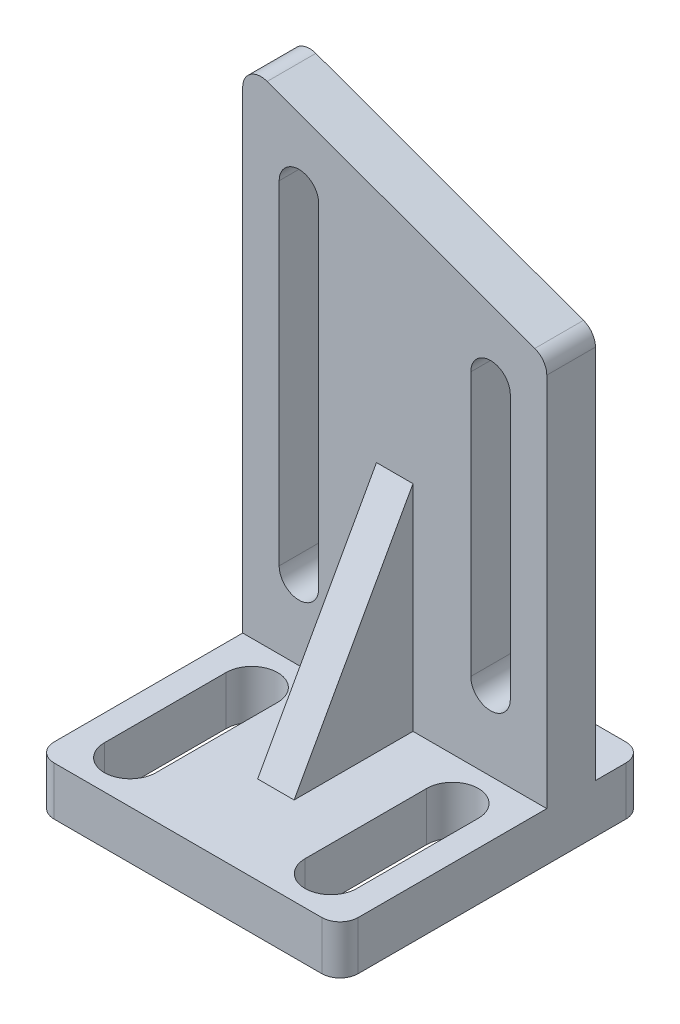
ISO-10303-21;
HEADER;
FILE_DESCRIPTION(('STEP AP214'),'2;1');
FILE_NAME('part.step','',(''),(''),'','','');
FILE_SCHEMA(('AUTOMOTIVE_DESIGN { 1 0 10303 214 1 1 1 1 }'));
ENDSEC;
DATA;
#1=APPLICATION_CONTEXT('core data for automotive mechanical design processes');
#2=APPLICATION_PROTOCOL_DEFINITION('international standard','automotive_design',2000,#1);
#3=PRODUCT_CONTEXT('',#1,'mechanical');
#4=PRODUCT('Part','Part','',(#3));
#5=PRODUCT_RELATED_PRODUCT_CATEGORY('part','',(#4));
#6=PRODUCT_DEFINITION_FORMATION('','',#4);
#7=PRODUCT_DEFINITION_CONTEXT('part definition',#1,'design');
#8=PRODUCT_DEFINITION('design','',#6,#7);
#9=PRODUCT_DEFINITION_SHAPE('','',#8);
#10=(LENGTH_UNIT() NAMED_UNIT(*) SI_UNIT(.MILLI.,.METRE.));
#11=(NAMED_UNIT(*) PLANE_ANGLE_UNIT() SI_UNIT($,.RADIAN.));
#12=(NAMED_UNIT(*) SI_UNIT($,.STERADIAN.) SOLID_ANGLE_UNIT());
#13=UNCERTAINTY_MEASURE_WITH_UNIT(LENGTH_MEASURE(1.E-05),#10,'distance_accuracy_value','');
#14=(GEOMETRIC_REPRESENTATION_CONTEXT(3) GLOBAL_UNCERTAINTY_ASSIGNED_CONTEXT((#13)) GLOBAL_UNIT_ASSIGNED_CONTEXT((#10,
#11,#12)) REPRESENTATION_CONTEXT('',''));
#15=CARTESIAN_POINT('',(0.,0.,0.));
#16=DIRECTION('',(0.,0.,1.));
#17=DIRECTION('',(1.,0.,0.));
#18=AXIS2_PLACEMENT_3D('',#15,#16,#17);
#19=CARTESIAN_POINT('',(0.,8.,0.));
#20=DIRECTION('',(0.,-1.,0.));
#21=DIRECTION('',(0.,0.,-1.));
#22=AXIS2_PLACEMENT_3D('',#19,#20,#21);
#23=PLANE('',#22);
#24=DIRECTION('',(0.,0.,1.));
#25=VECTOR('',#24,1.);
#26=CARTESIAN_POINT('',(12.25,8.,-2.));
#27=LINE('',#26,#25);
#28=CARTESIAN_POINT('',(12.25,8.,-2.));
#29=VERTEX_POINT('',#28);
#30=CARTESIAN_POINT('',(12.25,8.,18.));
#31=VERTEX_POINT('',#30);
#32=EDGE_CURVE('E375',#29,#31,#27,.T.);
#33=ORIENTED_EDGE('',*,*,#32,.F.);
#34=CARTESIAN_POINT('',(16.5,8.,-2.));
#35=DIRECTION('',(0.,1.,0.));
#36=DIRECTION('',(0.,0.,-1.));
#37=AXIS2_PLACEMENT_3D('',#34,#35,#36);
#38=CIRCLE('',#37,4.25);
#39=CARTESIAN_POINT('',(20.75,8.,-2.));
#40=VERTEX_POINT('',#39);
#41=EDGE_CURVE('E325',#40,#29,#38,.T.);
#42=ORIENTED_EDGE('',*,*,#41,.F.);
#43=DIRECTION('',(0.,0.,-1.));
#44=VECTOR('',#43,1.);
#45=CARTESIAN_POINT('',(20.75,8.,-2.));
#46=LINE('',#45,#44);
#47=CARTESIAN_POINT('',(20.75,8.,18.));
#48=VERTEX_POINT('',#47);
#49=EDGE_CURVE('E364',#48,#40,#46,.T.);
#50=ORIENTED_EDGE('',*,*,#49,.F.);
#51=CARTESIAN_POINT('',(16.5,8.,18.));
#52=DIRECTION('',(0.,1.,0.));
#53=DIRECTION('',(0.,0.,-1.));
#54=AXIS2_PLACEMENT_3D('',#51,#52,#53);
#55=CIRCLE('',#54,4.25);
#56=EDGE_CURVE('E378',#31,#48,#55,.T.);
#57=ORIENTED_EDGE('',*,*,#56,.F.);
#58=EDGE_LOOP('',(#33,#42,#50,#57));
#59=FACE_BOUND('',#58,.T.);
#60=DIRECTION('',(0.,0.,1.));
#61=VECTOR('',#60,1.);
#62=CARTESIAN_POINT('',(-20.75,8.,-2.));
#63=LINE('',#62,#61);
#64=CARTESIAN_POINT('',(-20.75,8.,-2.));
#65=VERTEX_POINT('',#64);
#66=CARTESIAN_POINT('',(-20.75,8.,18.));
#67=VERTEX_POINT('',#66);
#68=EDGE_CURVE('E342',#65,#67,#63,.T.);
#69=ORIENTED_EDGE('',*,*,#68,.F.);
#70=CARTESIAN_POINT('',(-16.5,8.,-2.));
#71=DIRECTION('',(0.,1.,0.));
#72=DIRECTION('',(0.,0.,1.));
#73=AXIS2_PLACEMENT_3D('',#70,#71,#72);
#74=CIRCLE('',#73,4.25);
#75=CARTESIAN_POINT('',(-12.25,8.,-2.));
#76=VERTEX_POINT('',#75);
#77=EDGE_CURVE('E340',#76,#65,#74,.T.);
#78=ORIENTED_EDGE('',*,*,#77,.F.);
#79=DIRECTION('',(0.,0.,-1.));
#80=VECTOR('',#79,1.);
#81=CARTESIAN_POINT('',(-12.25,8.,-2.));
#82=LINE('',#81,#80);
#83=CARTESIAN_POINT('',(-12.25,8.,18.));
#84=VERTEX_POINT('',#83);
#85=EDGE_CURVE('E330',#84,#76,#82,.T.);
#86=ORIENTED_EDGE('',*,*,#85,.F.);
#87=CARTESIAN_POINT('',(-16.5,8.,18.));
#88=DIRECTION('',(0.,1.,0.));
#89=DIRECTION('',(0.,0.,1.));
#90=AXIS2_PLACEMENT_3D('',#87,#88,#89);
#91=CIRCLE('',#90,4.25);
#92=EDGE_CURVE('E346',#67,#84,#91,.T.);
#93=ORIENTED_EDGE('',*,*,#92,.F.);
#94=EDGE_LOOP('',(#69,#78,#86,#93));
#95=FACE_BOUND('',#94,.T.);
#96=DIRECTION('',(1.,0.,0.));
#97=VECTOR('',#96,1.);
#98=CARTESIAN_POINT('',(25.,8.,25.));
#99=LINE('',#98,#97);
#100=CARTESIAN_POINT('',(-22.,8.,25.));
#101=VERTEX_POINT('',#100);
#102=CARTESIAN_POINT('',(22.,8.,25.));
#103=VERTEX_POINT('',#102);
#104=EDGE_CURVE('E415',#101,#103,#99,.T.);
#105=ORIENTED_EDGE('',*,*,#104,.T.);
#106=CARTESIAN_POINT('',(22.,8.,22.));
#107=DIRECTION('',(0.,-1.,0.));
#108=DIRECTION('',(0.,0.,-1.));
#109=AXIS2_PLACEMENT_3D('',#106,#107,#108);
#110=CIRCLE('',#109,3.);
#111=CARTESIAN_POINT('',(25.,8.,22.));
#112=VERTEX_POINT('',#111);
#113=EDGE_CURVE('E496',#103,#112,#110,.F.);
#114=ORIENTED_EDGE('',*,*,#113,.T.);
#115=DIRECTION('',(0.,0.,-1.));
#116=VECTOR('',#115,1.);
#117=CARTESIAN_POINT('',(25.,8.,-25.));
#118=LINE('',#117,#116);
#119=CARTESIAN_POINT('',(25.,8.,-9.00000000000001));
#120=VERTEX_POINT('',#119);
#121=EDGE_CURVE('E420',#112,#120,#118,.T.);
#122=ORIENTED_EDGE('',*,*,#121,.T.);
#123=DIRECTION('',(-1.,0.,0.));
#124=VECTOR('',#123,1.);
#125=CARTESIAN_POINT('',(0.,8.,-9.));
#126=LINE('',#125,#124);
#127=CARTESIAN_POINT('',(2.99999999999999,8.,-9.));
#128=VERTEX_POINT('',#127);
#129=EDGE_CURVE('E409',#120,#128,#126,.T.);
#130=ORIENTED_EDGE('',*,*,#129,.T.);
#131=DIRECTION('',(0.,0.,-1.));
#132=VECTOR('',#131,1.);
#133=CARTESIAN_POINT('',(2.99999999999999,8.,-9.00000000000001));
#134=LINE('',#133,#132);
#135=CARTESIAN_POINT('',(2.99999999999999,8.,10.5433612739258));
#136=VERTEX_POINT('',#135);
#137=EDGE_CURVE('E311',#136,#128,#134,.T.);
#138=ORIENTED_EDGE('',*,*,#137,.F.);
#139=DIRECTION('',(-1.,0.,0.));
#140=VECTOR('',#139,1.);
#141=CARTESIAN_POINT('',(2.99999999999999,8.,10.5433612739258));
#142=LINE('',#141,#140);
#143=CARTESIAN_POINT('',(-3.00000000000001,8.,10.5433612739258));
#144=VERTEX_POINT('',#143);
#145=EDGE_CURVE('E314',#136,#144,#142,.T.);
#146=ORIENTED_EDGE('',*,*,#145,.T.);
#147=DIRECTION('',(0.,0.,-1.));
#148=VECTOR('',#147,1.);
#149=CARTESIAN_POINT('',(-3.00000000000001,8.,-9.00000000000001));
#150=LINE('',#149,#148);
#151=CARTESIAN_POINT('',(-3.00000000000001,8.,-9.00000000000001));
#152=VERTEX_POINT('',#151);
#153=EDGE_CURVE('E308',#144,#152,#150,.T.);
#154=ORIENTED_EDGE('',*,*,#153,.T.);
#155=CARTESIAN_POINT('',(-25.,8.,-9.));
#156=VERTEX_POINT('',#155);
#157=EDGE_CURVE('E408',#152,#156,#126,.T.);
#158=ORIENTED_EDGE('',*,*,#157,.T.);
#159=DIRECTION('',(0.,0.,1.));
#160=VECTOR('',#159,1.);
#161=CARTESIAN_POINT('',(-25.,8.,-25.));
#162=LINE('',#161,#160);
#163=CARTESIAN_POINT('',(-25.,8.,22.));
#164=VERTEX_POINT('',#163);
#165=EDGE_CURVE('E416',#156,#164,#162,.T.);
#166=ORIENTED_EDGE('',*,*,#165,.T.);
#167=CARTESIAN_POINT('',(-22.,8.,22.));
#168=DIRECTION('',(0.,-1.,0.));
#169=DIRECTION('',(0.,0.,-1.));
#170=AXIS2_PLACEMENT_3D('',#167,#168,#169);
#171=CIRCLE('',#170,3.);
#172=EDGE_CURVE('E494',#164,#101,#171,.F.);
#173=ORIENTED_EDGE('',*,*,#172,.T.);
#174=EDGE_LOOP('',(#105,#114,#122,#130,#138,#146,#154,#158,#166,#173));
#175=FACE_BOUND('',#174,.T.);
#176=ADVANCED_FACE('F33',(#59,#95,#175),#23,.F.);
#177=CARTESIAN_POINT('',(0.,0.,-9.));
#178=DIRECTION('',(0.,0.,1.));
#179=DIRECTION('',(1.,0.,0.));
#180=AXIS2_PLACEMENT_3D('',#177,#178,#179);
#181=PLANE('',#180);
#182=CARTESIAN_POINT('',(-15.75,75.4013516147973,-9.));
#183=DIRECTION('',(0.,0.,1.));
#184=DIRECTION('',(1.,0.,0.));
#185=AXIS2_PLACEMENT_3D('',#182,#183,#184);
#186=CIRCLE('',#185,3.25);
#187=CARTESIAN_POINT('',(-12.5,75.4013516147973,-9.));
#188=VERTEX_POINT('',#187);
#189=CARTESIAN_POINT('',(-19.,75.4013516147973,-9.));
#190=VERTEX_POINT('',#189);
#191=EDGE_CURVE('E269',#188,#190,#186,.T.);
#192=ORIENTED_EDGE('',*,*,#191,.F.);
#193=DIRECTION('',(0.,1.,0.));
#194=VECTOR('',#193,1.);
#195=CARTESIAN_POINT('',(-12.5,75.4013516147973,-9.));
#196=LINE('',#195,#194);
#197=CARTESIAN_POINT('',(-12.5,20.5667689330291,-9.));
#198=VERTEX_POINT('',#197);
#199=EDGE_CURVE('E274',#198,#188,#196,.T.);
#200=ORIENTED_EDGE('',*,*,#199,.F.);
#201=CARTESIAN_POINT('',(-15.75,20.5667689330291,-9.));
#202=DIRECTION('',(0.,0.,1.));
#203=DIRECTION('',(1.,0.,0.));
#204=AXIS2_PLACEMENT_3D('',#201,#202,#203);
#205=CIRCLE('',#204,3.25);
#206=CARTESIAN_POINT('',(-19.,20.5667689330291,-9.));
#207=VERTEX_POINT('',#206);
#208=EDGE_CURVE('E253',#207,#198,#205,.T.);
#209=ORIENTED_EDGE('',*,*,#208,.F.);
#210=DIRECTION('',(0.,-1.,0.));
#211=VECTOR('',#210,1.);
#212=CARTESIAN_POINT('',(-19.,75.4013516147973,-9.));
#213=LINE('',#212,#211);
#214=EDGE_CURVE('E264',#190,#207,#213,.T.);
#215=ORIENTED_EDGE('',*,*,#214,.F.);
#216=EDGE_LOOP('',(#192,#200,#209,#215));
#217=FACE_BOUND('',#216,.T.);
#218=CARTESIAN_POINT('',(15.75,63.936289235412,-9.));
#219=DIRECTION('',(0.,0.,1.));
#220=DIRECTION('',(1.,0.,0.));
#221=AXIS2_PLACEMENT_3D('',#218,#219,#220);
#222=CIRCLE('',#221,3.25);
#223=CARTESIAN_POINT('',(19.,63.936289235412,-9.));
#224=VERTEX_POINT('',#223);
#225=CARTESIAN_POINT('',(12.5,63.936289235412,-9.));
#226=VERTEX_POINT('',#225);
#227=EDGE_CURVE('E284',#224,#226,#222,.T.);
#228=ORIENTED_EDGE('',*,*,#227,.F.);
#229=DIRECTION('',(0.,1.,0.));
#230=VECTOR('',#229,1.);
#231=CARTESIAN_POINT('',(19.,63.936289235412,-9.));
#232=LINE('',#231,#230);
#233=CARTESIAN_POINT('',(19.,20.5667689330291,-9.));
#234=VERTEX_POINT('',#233);
#235=EDGE_CURVE('E292',#234,#224,#232,.T.);
#236=ORIENTED_EDGE('',*,*,#235,.F.);
#237=CARTESIAN_POINT('',(15.75,20.5667689330291,-9.));
#238=DIRECTION('',(0.,0.,1.));
#239=DIRECTION('',(1.,0.,0.));
#240=AXIS2_PLACEMENT_3D('',#237,#238,#239);
#241=CIRCLE('',#240,3.25);
#242=CARTESIAN_POINT('',(12.5,20.5667689330291,-9.));
#243=VERTEX_POINT('',#242);
#244=EDGE_CURVE('E289',#243,#234,#241,.T.);
#245=ORIENTED_EDGE('',*,*,#244,.F.);
#246=DIRECTION('',(0.,-1.,0.));
#247=VECTOR('',#246,1.);
#248=CARTESIAN_POINT('',(12.5,63.936289235412,-9.));
#249=LINE('',#248,#247);
#250=EDGE_CURVE('E286',#226,#243,#249,.T.);
#251=ORIENTED_EDGE('',*,*,#250,.F.);
#252=EDGE_LOOP('',(#228,#236,#245,#251));
#253=FACE_BOUND('',#252,.T.);
#254=DIRECTION('',(0.,-1.,0.));
#255=VECTOR('',#254,1.);
#256=CARTESIAN_POINT('',(25.,0.,-9.00000000000001));
#257=LINE('',#256,#255);
#258=CARTESIAN_POINT('',(25.,69.7189419538205,-9.00000000000001));
#259=VERTEX_POINT('',#258);
#260=EDGE_CURVE('E396',#259,#120,#257,.T.);
#261=ORIENTED_EDGE('',*,*,#260,.F.);
#262=CARTESIAN_POINT('',(22.,69.7189419538205,-9.00000000000001));
#263=DIRECTION('',(0.,0.,1.));
#264=DIRECTION('',(1.,0.,0.));
#265=AXIS2_PLACEMENT_3D('',#262,#263,#264);
#266=CIRCLE('',#265,3.);
#267=CARTESIAN_POINT('',(23.026060429977,72.5380198161783,-9.00000000000001));
#268=VERTEX_POINT('',#267);
#269=EDGE_CURVE('E11',#259,#268,#266,.T.);
#270=ORIENTED_EDGE('',*,*,#269,.T.);
#271=DIRECTION('',(0.939692620785909,-0.342020143325666,0.));
#272=VECTOR('',#271,1.);
#273=CARTESIAN_POINT('',(25.,71.8195645684497,-9.00000000000001));
#274=LINE('',#273,#272);
#275=CARTESIAN_POINT('',(-20.973939570023,88.552710123891,-9.));
#276=VERTEX_POINT('',#275);
#277=EDGE_CURVE('E393',#276,#268,#274,.T.);
#278=ORIENTED_EDGE('',*,*,#277,.F.);
#279=CARTESIAN_POINT('',(-22.,85.7336322615333,-9.));
#280=DIRECTION('',(0.,0.,1.));
#281=DIRECTION('',(1.,0.,0.));
#282=AXIS2_PLACEMENT_3D('',#279,#280,#281);
#283=CIRCLE('',#282,3.);
#284=CARTESIAN_POINT('',(-25.,85.7336322615333,-9.));
#285=VERTEX_POINT('',#284);
#286=EDGE_CURVE('E41',#276,#285,#283,.T.);
#287=ORIENTED_EDGE('',*,*,#286,.T.);
#288=DIRECTION('',(0.,1.,0.));
#289=VECTOR('',#288,1.);
#290=CARTESIAN_POINT('',(-25.,90.0180762817596,-9.));
#291=LINE('',#290,#289);
#292=EDGE_CURVE('E390',#156,#285,#291,.T.);
#293=ORIENTED_EDGE('',*,*,#292,.F.);
#294=ORIENTED_EDGE('',*,*,#157,.F.);
#295=DIRECTION('',(0.,1.,0.));
#296=VECTOR('',#295,1.);
#297=CARTESIAN_POINT('',(-3.00000000000001,43.2717797491536,-9.));
#298=LINE('',#297,#296);
#299=CARTESIAN_POINT('',(-3.00000000000001,43.2717797491536,-9.));
#300=VERTEX_POINT('',#299);
#301=EDGE_CURVE('E281',#152,#300,#298,.T.);
#302=ORIENTED_EDGE('',*,*,#301,.T.);
#303=DIRECTION('',(-1.,0.,0.));
#304=VECTOR('',#303,1.);
#305=CARTESIAN_POINT('',(2.99999999999999,43.2717797491536,-9.));
#306=LINE('',#305,#304);
#307=CARTESIAN_POINT('',(2.99999999999999,43.2717797491536,-9.));
#308=VERTEX_POINT('',#307);
#309=EDGE_CURVE('E322',#308,#300,#306,.T.);
#310=ORIENTED_EDGE('',*,*,#309,.F.);
#311=DIRECTION('',(0.,1.,0.));
#312=VECTOR('',#311,1.);
#313=CARTESIAN_POINT('',(2.99999999999999,43.2717797491536,-9.));
#314=LINE('',#313,#312);
#315=EDGE_CURVE('E304',#128,#308,#314,.T.);
#316=ORIENTED_EDGE('',*,*,#315,.F.);
#317=ORIENTED_EDGE('',*,*,#129,.F.);
#318=EDGE_LOOP('',(#261,#270,#278,#287,#293,#294,#302,#310,#316,#317));
#319=FACE_BOUND('',#318,.T.);
#320=ADVANCED_FACE('F271',(#217,#253,#319),#181,.T.);
#321=CARTESIAN_POINT('',(25.,8.,-17.));
#322=VERTEX_POINT('',#321);
#323=CARTESIAN_POINT('',(25.,8.,-22.));
#324=VERTEX_POINT('',#323);
#325=EDGE_CURVE('E419',#322,#324,#118,.T.);
#326=ORIENTED_EDGE('',*,*,#325,.T.);
#327=CARTESIAN_POINT('',(22.,8.,-22.));
#328=DIRECTION('',(0.,-1.,0.));
#329=DIRECTION('',(0.,0.,-1.));
#330=AXIS2_PLACEMENT_3D('',#327,#328,#329);
#331=CIRCLE('',#330,3.);
#332=CARTESIAN_POINT('',(22.,8.,-25.));
#333=VERTEX_POINT('',#332);
#334=EDGE_CURVE('E479',#324,#333,#331,.F.);
#335=ORIENTED_EDGE('',*,*,#334,.T.);
#336=DIRECTION('',(-1.,0.,0.));
#337=VECTOR('',#336,1.);
#338=CARTESIAN_POINT('',(25.,8.,-25.));
#339=LINE('',#338,#337);
#340=CARTESIAN_POINT('',(-22.,8.,-25.));
#341=VERTEX_POINT('',#340);
#342=EDGE_CURVE('E422',#333,#341,#339,.T.);
#343=ORIENTED_EDGE('',*,*,#342,.T.);
#344=CARTESIAN_POINT('',(-22.,8.,-22.));
#345=DIRECTION('',(0.,-1.,0.));
#346=DIRECTION('',(0.,0.,-1.));
#347=AXIS2_PLACEMENT_3D('',#344,#345,#346);
#348=CIRCLE('',#347,3.);
#349=CARTESIAN_POINT('',(-25.,8.,-22.));
#350=VERTEX_POINT('',#349);
#351=EDGE_CURVE('E477',#341,#350,#348,.F.);
#352=ORIENTED_EDGE('',*,*,#351,.T.);
#353=CARTESIAN_POINT('',(-25.,8.00000000000004,-17.));
#354=VERTEX_POINT('',#353);
#355=EDGE_CURVE('E413',#350,#354,#162,.T.);
#356=ORIENTED_EDGE('',*,*,#355,.T.);
#357=DIRECTION('',(-1.,0.,0.));
#358=VECTOR('',#357,1.);
#359=CARTESIAN_POINT('',(0.,8.,-17.));
#360=LINE('',#359,#358);
#361=EDGE_CURVE('E399',#322,#354,#360,.T.);
#362=ORIENTED_EDGE('',*,*,#361,.F.);
#363=EDGE_LOOP('',(#326,#335,#343,#352,#356,#362));
#364=FACE_BOUND('',#363,.T.);
#365=ADVANCED_FACE('F531',(#364),#23,.F.);
#366=CARTESIAN_POINT('',(-25.,8.,-25.));
#367=DIRECTION('',(1.,0.,0.));
#368=DIRECTION('',(0.,0.,-1.));
#369=AXIS2_PLACEMENT_3D('',#366,#367,#368);
#370=PLANE('',#369);
#371=ORIENTED_EDGE('',*,*,#355,.F.);
#372=DIRECTION('',(0.,-1.,0.));
#373=VECTOR('',#372,1.);
#374=CARTESIAN_POINT('',(-25.,8.,-22.));
#375=LINE('',#374,#373);
#376=CARTESIAN_POINT('',(-25.,0.,-22.));
#377=VERTEX_POINT('',#376);
#378=EDGE_CURVE('E486',#350,#377,#375,.T.);
#379=ORIENTED_EDGE('',*,*,#378,.T.);
#380=DIRECTION('',(0.,0.,1.));
#381=VECTOR('',#380,1.);
#382=CARTESIAN_POINT('',(-25.,0.,-25.));
#383=LINE('',#382,#381);
#384=CARTESIAN_POINT('',(-25.,0.,22.));
#385=VERTEX_POINT('',#384);
#386=EDGE_CURVE('E412',#377,#385,#383,.T.);
#387=ORIENTED_EDGE('',*,*,#386,.T.);
#388=DIRECTION('',(0.,-1.,0.));
#389=VECTOR('',#388,1.);
#390=CARTESIAN_POINT('',(-25.,8.,22.));
#391=LINE('',#390,#389);
#392=EDGE_CURVE('E484',#385,#164,#391,.F.);
#393=ORIENTED_EDGE('',*,*,#392,.T.);
#394=ORIENTED_EDGE('',*,*,#165,.F.);
#395=ORIENTED_EDGE('',*,*,#292,.T.);
#396=DIRECTION('',(0.,0.,-1.));
#397=VECTOR('',#396,1.);
#398=CARTESIAN_POINT('',(-25.,85.7336322615333,-17.));
#399=LINE('',#398,#397);
#400=CARTESIAN_POINT('',(-25.,85.7336322615333,-17.));
#401=VERTEX_POINT('',#400);
#402=EDGE_CURVE('E481',#285,#401,#399,.T.);
#403=ORIENTED_EDGE('',*,*,#402,.T.);
#404=DIRECTION('',(0.,1.,0.));
#405=VECTOR('',#404,1.);
#406=CARTESIAN_POINT('',(-25.,90.0180762817596,-17.));
#407=LINE('',#406,#405);
#408=EDGE_CURVE('E353',#354,#401,#407,.T.);
#409=ORIENTED_EDGE('',*,*,#408,.F.);
#410=EDGE_LOOP('',(#371,#379,#387,#393,#394,#395,#403,#409));
#411=FACE_BOUND('',#410,.T.);
#412=ADVANCED_FACE('F512',(#411),#370,.F.);
#413=CARTESIAN_POINT('',(25.,8.,25.));
#414=DIRECTION('',(0.,0.,-1.));
#415=DIRECTION('',(-1.,0.,0.));
#416=AXIS2_PLACEMENT_3D('',#413,#414,#415);
#417=PLANE('',#416);
#418=DIRECTION('',(1.,0.,0.));
#419=VECTOR('',#418,1.);
#420=CARTESIAN_POINT('',(25.,0.,25.));
#421=LINE('',#420,#419);
#422=CARTESIAN_POINT('',(-22.,0.,25.));
#423=VERTEX_POINT('',#422);
#424=CARTESIAN_POINT('',(22.,0.,25.));
#425=VERTEX_POINT('',#424);
#426=EDGE_CURVE('E428',#423,#425,#421,.T.);
#427=ORIENTED_EDGE('',*,*,#426,.T.);
#428=DIRECTION('',(0.,-1.,0.));
#429=VECTOR('',#428,1.);
#430=CARTESIAN_POINT('',(22.,8.,25.));
#431=LINE('',#430,#429);
#432=EDGE_CURVE('E492',#425,#103,#431,.F.);
#433=ORIENTED_EDGE('',*,*,#432,.T.);
#434=ORIENTED_EDGE('',*,*,#104,.F.);
#435=DIRECTION('',(0.,-1.,0.));
#436=VECTOR('',#435,1.);
#437=CARTESIAN_POINT('',(-22.,8.,25.));
#438=LINE('',#437,#436);
#439=EDGE_CURVE('E489',#101,#423,#438,.T.);
#440=ORIENTED_EDGE('',*,*,#439,.T.);
#441=EDGE_LOOP('',(#427,#433,#434,#440));
#442=FACE_BOUND('',#441,.T.);
#443=ADVANCED_FACE('F557',(#442),#417,.F.);
#444=CARTESIAN_POINT('',(25.,8.,-25.));
#445=DIRECTION('',(-1.,0.,0.));
#446=DIRECTION('',(0.,0.,1.));
#447=AXIS2_PLACEMENT_3D('',#444,#445,#446);
#448=PLANE('',#447);
#449=DIRECTION('',(0.,0.,-1.));
#450=VECTOR('',#449,1.);
#451=CARTESIAN_POINT('',(25.,0.,-25.));
#452=LINE('',#451,#450);
#453=CARTESIAN_POINT('',(25.,0.,22.));
#454=VERTEX_POINT('',#453);
#455=CARTESIAN_POINT('',(25.,0.,-22.));
#456=VERTEX_POINT('',#455);
#457=EDGE_CURVE('E431',#454,#456,#452,.T.);
#458=ORIENTED_EDGE('',*,*,#457,.T.);
#459=DIRECTION('',(0.,-1.,0.));
#460=VECTOR('',#459,1.);
#461=CARTESIAN_POINT('',(25.,8.,-22.));
#462=LINE('',#461,#460);
#463=EDGE_CURVE('E475',#456,#324,#462,.F.);
#464=ORIENTED_EDGE('',*,*,#463,.T.);
#465=ORIENTED_EDGE('',*,*,#325,.F.);
#466=DIRECTION('',(0.,-1.,0.));
#467=VECTOR('',#466,1.);
#468=CARTESIAN_POINT('',(25.,0.,-17.));
#469=LINE('',#468,#467);
#470=CARTESIAN_POINT('',(25.,69.7189419538205,-17.));
#471=VERTEX_POINT('',#470);
#472=EDGE_CURVE('E394',#471,#322,#469,.T.);
#473=ORIENTED_EDGE('',*,*,#472,.F.);
#474=DIRECTION('',(0.,0.,-1.));
#475=VECTOR('',#474,1.);
#476=CARTESIAN_POINT('',(25.,69.7189419538205,-9.00000000000001));
#477=LINE('',#476,#475);
#478=EDGE_CURVE('E470',#471,#259,#477,.F.);
#479=ORIENTED_EDGE('',*,*,#478,.T.);
#480=ORIENTED_EDGE('',*,*,#260,.T.);
#481=ORIENTED_EDGE('',*,*,#121,.F.);
#482=DIRECTION('',(0.,-1.,0.));
#483=VECTOR('',#482,1.);
#484=CARTESIAN_POINT('',(25.,8.,22.));
#485=LINE('',#484,#483);
#486=EDGE_CURVE('E472',#112,#454,#485,.T.);
#487=ORIENTED_EDGE('',*,*,#486,.T.);
#488=EDGE_LOOP('',(#458,#464,#465,#473,#479,#480,#481,#487));
#489=FACE_BOUND('',#488,.T.);
#490=ADVANCED_FACE('F526',(#489),#448,.F.);
#491=CARTESIAN_POINT('',(25.,8.,-25.));
#492=DIRECTION('',(0.,0.,1.));
#493=DIRECTION('',(1.,0.,0.));
#494=AXIS2_PLACEMENT_3D('',#491,#492,#493);
#495=PLANE('',#494);
#496=ORIENTED_EDGE('',*,*,#342,.F.);
#497=DIRECTION('',(0.,-1.,0.));
#498=VECTOR('',#497,1.);
#499=CARTESIAN_POINT('',(22.,8.,-25.));
#500=LINE('',#499,#498);
#501=CARTESIAN_POINT('',(22.,0.,-25.));
#502=VERTEX_POINT('',#501);
#503=EDGE_CURVE('E459',#333,#502,#500,.T.);
#504=ORIENTED_EDGE('',*,*,#503,.T.);
#505=DIRECTION('',(-1.,0.,0.));
#506=VECTOR('',#505,1.);
#507=CARTESIAN_POINT('',(25.,0.,-25.));
#508=LINE('',#507,#506);
#509=CARTESIAN_POINT('',(-22.,0.,-25.));
#510=VERTEX_POINT('',#509);
#511=EDGE_CURVE('E434',#502,#510,#508,.T.);
#512=ORIENTED_EDGE('',*,*,#511,.T.);
#513=DIRECTION('',(0.,-1.,0.));
#514=VECTOR('',#513,1.);
#515=CARTESIAN_POINT('',(-22.,8.,-25.));
#516=LINE('',#515,#514);
#517=EDGE_CURVE('E457',#510,#341,#516,.F.);
#518=ORIENTED_EDGE('',*,*,#517,.T.);
#519=EDGE_LOOP('',(#496,#504,#512,#518));
#520=FACE_BOUND('',#519,.T.);
#521=ADVANCED_FACE('F538',(#520),#495,.F.);
#522=CARTESIAN_POINT('',(0.,0.,0.));
#523=DIRECTION('',(0.,-1.,0.));
#524=DIRECTION('',(0.,0.,-1.));
#525=AXIS2_PLACEMENT_3D('',#522,#523,#524);
#526=PLANE('',#525);
#527=CARTESIAN_POINT('',(-16.5,0.,-2.));
#528=DIRECTION('',(0.,1.,0.));
#529=DIRECTION('',(0.,0.,1.));
#530=AXIS2_PLACEMENT_3D('',#527,#528,#529);
#531=CIRCLE('',#530,4.25);
#532=CARTESIAN_POINT('',(-12.25,0.,-2.));
#533=VERTEX_POINT('',#532);
#534=CARTESIAN_POINT('',(-20.75,0.,-2.));
#535=VERTEX_POINT('',#534);
#536=EDGE_CURVE('E326',#533,#535,#531,.T.);
#537=ORIENTED_EDGE('',*,*,#536,.T.);
#538=DIRECTION('',(0.,0.,1.));
#539=VECTOR('',#538,1.);
#540=CARTESIAN_POINT('',(-20.75,0.,-2.));
#541=LINE('',#540,#539);
#542=CARTESIAN_POINT('',(-20.75,0.,18.));
#543=VERTEX_POINT('',#542);
#544=EDGE_CURVE('E329',#535,#543,#541,.T.);
#545=ORIENTED_EDGE('',*,*,#544,.T.);
#546=CARTESIAN_POINT('',(-16.5,0.,18.));
#547=DIRECTION('',(0.,1.,0.));
#548=DIRECTION('',(0.,0.,1.));
#549=AXIS2_PLACEMENT_3D('',#546,#547,#548);
#550=CIRCLE('',#549,4.25);
#551=CARTESIAN_POINT('',(-12.25,0.,18.));
#552=VERTEX_POINT('',#551);
#553=EDGE_CURVE('E333',#543,#552,#550,.T.);
#554=ORIENTED_EDGE('',*,*,#553,.T.);
#555=DIRECTION('',(0.,0.,-1.));
#556=VECTOR('',#555,1.);
#557=CARTESIAN_POINT('',(-12.25,0.,-2.));
#558=LINE('',#557,#556);
#559=EDGE_CURVE('E336',#552,#533,#558,.T.);
#560=ORIENTED_EDGE('',*,*,#559,.T.);
#561=EDGE_LOOP('',(#537,#545,#554,#560));
#562=FACE_BOUND('',#561,.T.);
#563=CARTESIAN_POINT('',(16.5,0.,-2.));
#564=DIRECTION('',(0.,1.,0.));
#565=DIRECTION('',(0.,0.,-1.));
#566=AXIS2_PLACEMENT_3D('',#563,#564,#565);
#567=CIRCLE('',#566,4.25);
#568=CARTESIAN_POINT('',(20.75,0.,-2.));
#569=VERTEX_POINT('',#568);
#570=CARTESIAN_POINT('',(12.25,0.,-2.));
#571=VERTEX_POINT('',#570);
#572=EDGE_CURVE('E360',#569,#571,#567,.T.);
#573=ORIENTED_EDGE('',*,*,#572,.T.);
#574=DIRECTION('',(0.,0.,1.));
#575=VECTOR('',#574,1.);
#576=CARTESIAN_POINT('',(12.25,0.,-2.));
#577=LINE('',#576,#575);
#578=CARTESIAN_POINT('',(12.25,0.,18.));
#579=VERTEX_POINT('',#578);
#580=EDGE_CURVE('E363',#571,#579,#577,.T.);
#581=ORIENTED_EDGE('',*,*,#580,.T.);
#582=CARTESIAN_POINT('',(16.5,0.,18.));
#583=DIRECTION('',(0.,1.,0.));
#584=DIRECTION('',(0.,0.,-1.));
#585=AXIS2_PLACEMENT_3D('',#582,#583,#584);
#586=CIRCLE('',#585,4.25);
#587=CARTESIAN_POINT('',(20.75,0.,18.));
#588=VERTEX_POINT('',#587);
#589=EDGE_CURVE('E367',#579,#588,#586,.T.);
#590=ORIENTED_EDGE('',*,*,#589,.T.);
#591=DIRECTION('',(0.,0.,-1.));
#592=VECTOR('',#591,1.);
#593=CARTESIAN_POINT('',(20.75,0.,-2.));
#594=LINE('',#593,#592);
#595=EDGE_CURVE('E370',#588,#569,#594,.T.);
#596=ORIENTED_EDGE('',*,*,#595,.T.);
#597=EDGE_LOOP('',(#573,#581,#590,#596));
#598=FACE_BOUND('',#597,.T.);
#599=ORIENTED_EDGE('',*,*,#511,.F.);
#600=CARTESIAN_POINT('',(22.,0.,-22.));
#601=DIRECTION('',(0.,-1.,0.));
#602=DIRECTION('',(0.,0.,-1.));
#603=AXIS2_PLACEMENT_3D('',#600,#601,#602);
#604=CIRCLE('',#603,3.);
#605=EDGE_CURVE('E468',#502,#456,#604,.T.);
#606=ORIENTED_EDGE('',*,*,#605,.T.);
#607=ORIENTED_EDGE('',*,*,#457,.F.);
#608=CARTESIAN_POINT('',(22.,0.,22.));
#609=DIRECTION('',(0.,-1.,0.));
#610=DIRECTION('',(0.,0.,-1.));
#611=AXIS2_PLACEMENT_3D('',#608,#609,#610);
#612=CIRCLE('',#611,3.);
#613=EDGE_CURVE('E464',#454,#425,#612,.T.);
#614=ORIENTED_EDGE('',*,*,#613,.T.);
#615=ORIENTED_EDGE('',*,*,#426,.F.);
#616=CARTESIAN_POINT('',(-22.,0.,22.));
#617=DIRECTION('',(0.,-1.,0.));
#618=DIRECTION('',(0.,0.,-1.));
#619=AXIS2_PLACEMENT_3D('',#616,#617,#618);
#620=CIRCLE('',#619,3.);
#621=EDGE_CURVE('E462',#423,#385,#620,.T.);
#622=ORIENTED_EDGE('',*,*,#621,.T.);
#623=ORIENTED_EDGE('',*,*,#386,.F.);
#624=CARTESIAN_POINT('',(-22.,0.,-22.));
#625=DIRECTION('',(0.,-1.,0.));
#626=DIRECTION('',(0.,0.,-1.));
#627=AXIS2_PLACEMENT_3D('',#624,#625,#626);
#628=CIRCLE('',#627,3.);
#629=EDGE_CURVE('E466',#377,#510,#628,.T.);
#630=ORIENTED_EDGE('',*,*,#629,.T.);
#631=EDGE_LOOP('',(#599,#606,#607,#614,#615,#622,#623,#630));
#632=FACE_BOUND('',#631,.T.);
#633=ADVANCED_FACE('F541',(#562,#598,#632),#526,.T.);
#634=CARTESIAN_POINT('',(0.,0.,-17.));
#635=DIRECTION('',(0.,0.,1.));
#636=DIRECTION('',(1.,0.,0.));
#637=AXIS2_PLACEMENT_3D('',#634,#635,#636);
#638=PLANE('',#637);
#639=DIRECTION('',(0.,1.,0.));
#640=VECTOR('',#639,1.);
#641=CARTESIAN_POINT('',(-12.5,0.,-17.));
#642=LINE('',#641,#640);
#643=CARTESIAN_POINT('',(-12.5,20.5667689330291,-17.));
#644=VERTEX_POINT('',#643);
#645=CARTESIAN_POINT('',(-12.5,75.4013516147973,-17.));
#646=VERTEX_POINT('',#645);
#647=EDGE_CURVE('E451',#644,#646,#642,.T.);
#648=ORIENTED_EDGE('',*,*,#647,.T.);
#649=CARTESIAN_POINT('',(-15.75,75.4013516147973,-17.));
#650=DIRECTION('',(0.,0.,1.));
#651=DIRECTION('',(1.,0.,0.));
#652=AXIS2_PLACEMENT_3D('',#649,#650,#651);
#653=CIRCLE('',#652,3.25);
#654=CARTESIAN_POINT('',(-19.,75.4013516147973,-17.));
#655=VERTEX_POINT('',#654);
#656=EDGE_CURVE('E454',#646,#655,#653,.T.);
#657=ORIENTED_EDGE('',*,*,#656,.T.);
#658=DIRECTION('',(0.,-1.,0.));
#659=VECTOR('',#658,1.);
#660=CARTESIAN_POINT('',(-19.,0.,-17.));
#661=LINE('',#660,#659);
#662=CARTESIAN_POINT('',(-19.,20.5667689330291,-17.));
#663=VERTEX_POINT('',#662);
#664=EDGE_CURVE('E448',#655,#663,#661,.T.);
#665=ORIENTED_EDGE('',*,*,#664,.T.);
#666=CARTESIAN_POINT('',(-15.75,20.5667689330291,-17.));
#667=DIRECTION('',(0.,0.,1.));
#668=DIRECTION('',(1.,0.,0.));
#669=AXIS2_PLACEMENT_3D('',#666,#667,#668);
#670=CIRCLE('',#669,3.25);
#671=EDGE_CURVE('E256',#663,#644,#670,.T.);
#672=ORIENTED_EDGE('',*,*,#671,.T.);
#673=EDGE_LOOP('',(#648,#657,#665,#672));
#674=FACE_BOUND('',#673,.T.);
#675=DIRECTION('',(0.,1.,0.));
#676=VECTOR('',#675,1.);
#677=CARTESIAN_POINT('',(19.,0.,-17.));
#678=LINE('',#677,#676);
#679=CARTESIAN_POINT('',(19.,20.5667689330291,-17.));
#680=VERTEX_POINT('',#679);
#681=CARTESIAN_POINT('',(19.,63.936289235412,-17.));
#682=VERTEX_POINT('',#681);
#683=EDGE_CURVE('E442',#680,#682,#678,.T.);
#684=ORIENTED_EDGE('',*,*,#683,.T.);
#685=CARTESIAN_POINT('',(15.75,63.936289235412,-17.));
#686=DIRECTION('',(0.,0.,1.));
#687=DIRECTION('',(1.,0.,0.));
#688=AXIS2_PLACEMENT_3D('',#685,#686,#687);
#689=CIRCLE('',#688,3.25);
#690=CARTESIAN_POINT('',(12.5,63.936289235412,-17.));
#691=VERTEX_POINT('',#690);
#692=EDGE_CURVE('E445',#682,#691,#689,.T.);
#693=ORIENTED_EDGE('',*,*,#692,.T.);
#694=DIRECTION('',(0.,-1.,0.));
#695=VECTOR('',#694,1.);
#696=CARTESIAN_POINT('',(12.5,0.,-17.));
#697=LINE('',#696,#695);
#698=CARTESIAN_POINT('',(12.5,20.5667689330291,-17.));
#699=VERTEX_POINT('',#698);
#700=EDGE_CURVE('E425',#691,#699,#697,.T.);
#701=ORIENTED_EDGE('',*,*,#700,.T.);
#702=CARTESIAN_POINT('',(15.75,20.5667689330291,-17.));
#703=DIRECTION('',(0.,0.,1.));
#704=DIRECTION('',(1.,0.,0.));
#705=AXIS2_PLACEMENT_3D('',#702,#703,#704);
#706=CIRCLE('',#705,3.25);
#707=EDGE_CURVE('E439',#699,#680,#706,.T.);
#708=ORIENTED_EDGE('',*,*,#707,.T.);
#709=EDGE_LOOP('',(#684,#693,#701,#708));
#710=FACE_BOUND('',#709,.T.);
#711=DIRECTION('',(0.939692620785909,-0.342020143325666,0.));
#712=VECTOR('',#711,1.);
#713=CARTESIAN_POINT('',(25.,71.8195645684497,-17.));
#714=LINE('',#713,#712);
#715=CARTESIAN_POINT('',(-20.973939570023,88.552710123891,-17.));
#716=VERTEX_POINT('',#715);
#717=CARTESIAN_POINT('',(23.026060429977,72.5380198161783,-17.));
#718=VERTEX_POINT('',#717);
#719=EDGE_CURVE('E402',#716,#718,#714,.T.);
#720=ORIENTED_EDGE('',*,*,#719,.T.);
#721=CARTESIAN_POINT('',(22.,69.7189419538205,-17.));
#722=DIRECTION('',(0.,0.,1.));
#723=DIRECTION('',(1.,0.,0.));
#724=AXIS2_PLACEMENT_3D('',#721,#722,#723);
#725=CIRCLE('',#724,3.);
#726=EDGE_CURVE('E504',#718,#471,#725,.F.);
#727=ORIENTED_EDGE('',*,*,#726,.T.);
#728=ORIENTED_EDGE('',*,*,#472,.T.);
#729=ORIENTED_EDGE('',*,*,#361,.T.);
#730=ORIENTED_EDGE('',*,*,#408,.T.);
#731=CARTESIAN_POINT('',(-22.,85.7336322615333,-17.));
#732=DIRECTION('',(0.,0.,1.));
#733=DIRECTION('',(1.,0.,0.));
#734=AXIS2_PLACEMENT_3D('',#731,#732,#733);
#735=CIRCLE('',#734,3.);
#736=EDGE_CURVE('E502',#401,#716,#735,.F.);
#737=ORIENTED_EDGE('',*,*,#736,.T.);
#738=EDGE_LOOP('',(#720,#727,#728,#729,#730,#737));
#739=FACE_BOUND('',#738,.T.);
#740=ADVANCED_FACE('F516',(#674,#710,#739),#638,.F.);
#741=CARTESIAN_POINT('',(25.,71.8195645684497,-9.00000000000001));
#742=DIRECTION('',(0.342020143325666,0.93969262078591,0.));
#743=DIRECTION('',(-0.93969262078591,0.342020143325666,0.));
#744=AXIS2_PLACEMENT_3D('',#741,#742,#743);
#745=PLANE('',#744);
#746=ORIENTED_EDGE('',*,*,#277,.T.);
#747=DIRECTION('',(0.,0.,-1.));
#748=VECTOR('',#747,1.);
#749=CARTESIAN_POINT('',(23.026060429977,72.5380198161783,-17.));
#750=LINE('',#749,#748);
#751=EDGE_CURVE('E499',#268,#718,#750,.T.);
#752=ORIENTED_EDGE('',*,*,#751,.T.);
#753=ORIENTED_EDGE('',*,*,#719,.F.);
#754=DIRECTION('',(0.,0.,-1.));
#755=VECTOR('',#754,1.);
#756=CARTESIAN_POINT('',(-20.973939570023,88.552710123891,-9.));
#757=LINE('',#756,#755);
#758=EDGE_CURVE('E53',#716,#276,#757,.F.);
#759=ORIENTED_EDGE('',*,*,#758,.T.);
#760=EDGE_LOOP('',(#746,#752,#753,#759));
#761=FACE_BOUND('',#760,.T.);
#762=ADVANCED_FACE('F517',(#761),#745,.T.);
#763=CARTESIAN_POINT('',(16.5,0.,-2.));
#764=DIRECTION('',(0.,1.,0.));
#765=DIRECTION('',(0.,0.,1.));
#766=AXIS2_PLACEMENT_3D('',#763,#764,#765);
#767=CYLINDRICAL_SURFACE('',#766,4.25);
#768=ORIENTED_EDGE('',*,*,#41,.T.);
#769=DIRECTION('',(0.,1.,0.));
#770=VECTOR('',#769,1.);
#771=CARTESIAN_POINT('',(12.25,0.,-2.));
#772=LINE('',#771,#770);
#773=EDGE_CURVE('E373',#571,#29,#772,.T.);
#774=ORIENTED_EDGE('',*,*,#773,.F.);
#775=ORIENTED_EDGE('',*,*,#572,.F.);
#776=DIRECTION('',(0.,1.,0.));
#777=VECTOR('',#776,1.);
#778=CARTESIAN_POINT('',(20.75,0.,-2.));
#779=LINE('',#778,#777);
#780=EDGE_CURVE('E343',#569,#40,#779,.T.);
#781=ORIENTED_EDGE('',*,*,#780,.T.);
#782=EDGE_LOOP('',(#768,#774,#775,#781));
#783=FACE_BOUND('',#782,.T.);
#784=ADVANCED_FACE('F662',(#783),#767,.F.);
#785=CARTESIAN_POINT('',(20.75,0.,-2.));
#786=DIRECTION('',(1.,0.,0.));
#787=DIRECTION('',(0.,0.,-1.));
#788=AXIS2_PLACEMENT_3D('',#785,#786,#787);
#789=PLANE('',#788);
#790=ORIENTED_EDGE('',*,*,#49,.T.);
#791=ORIENTED_EDGE('',*,*,#780,.F.);
#792=ORIENTED_EDGE('',*,*,#595,.F.);
#793=DIRECTION('',(0.,1.,0.));
#794=VECTOR('',#793,1.);
#795=CARTESIAN_POINT('',(20.75,0.,18.));
#796=LINE('',#795,#794);
#797=EDGE_CURVE('E384',#588,#48,#796,.T.);
#798=ORIENTED_EDGE('',*,*,#797,.T.);
#799=EDGE_LOOP('',(#790,#791,#792,#798));
#800=FACE_BOUND('',#799,.T.);
#801=ADVANCED_FACE('F855',(#800),#789,.F.);
#802=CARTESIAN_POINT('',(16.5,0.,18.));
#803=DIRECTION('',(0.,1.,0.));
#804=DIRECTION('',(0.,0.,1.));
#805=AXIS2_PLACEMENT_3D('',#802,#803,#804);
#806=CYLINDRICAL_SURFACE('',#805,4.25);
#807=ORIENTED_EDGE('',*,*,#56,.T.);
#808=ORIENTED_EDGE('',*,*,#797,.F.);
#809=ORIENTED_EDGE('',*,*,#589,.F.);
#810=DIRECTION('',(0.,1.,0.));
#811=VECTOR('',#810,1.);
#812=CARTESIAN_POINT('',(12.25,0.,18.));
#813=LINE('',#812,#811);
#814=EDGE_CURVE('E386',#579,#31,#813,.T.);
#815=ORIENTED_EDGE('',*,*,#814,.T.);
#816=EDGE_LOOP('',(#807,#808,#809,#815));
#817=FACE_BOUND('',#816,.T.);
#818=ADVANCED_FACE('F847',(#817),#806,.F.);
#819=CARTESIAN_POINT('',(12.25,0.,-2.));
#820=DIRECTION('',(-1.,0.,0.));
#821=DIRECTION('',(0.,0.,1.));
#822=AXIS2_PLACEMENT_3D('',#819,#820,#821);
#823=PLANE('',#822);
#824=ORIENTED_EDGE('',*,*,#32,.T.);
#825=ORIENTED_EDGE('',*,*,#814,.F.);
#826=ORIENTED_EDGE('',*,*,#580,.F.);
#827=ORIENTED_EDGE('',*,*,#773,.T.);
#828=EDGE_LOOP('',(#824,#825,#826,#827));
#829=FACE_BOUND('',#828,.T.);
#830=ADVANCED_FACE('F839',(#829),#823,.F.);
#831=CARTESIAN_POINT('',(-16.5,0.,-2.));
#832=DIRECTION('',(0.,1.,0.));
#833=DIRECTION('',(0.,0.,1.));
#834=AXIS2_PLACEMENT_3D('',#831,#832,#833);
#835=CYLINDRICAL_SURFACE('',#834,4.25);
#836=ORIENTED_EDGE('',*,*,#77,.T.);
#837=DIRECTION('',(0.,1.,0.));
#838=VECTOR('',#837,1.);
#839=CARTESIAN_POINT('',(-20.75,0.,-2.));
#840=LINE('',#839,#838);
#841=EDGE_CURVE('E339',#535,#65,#840,.T.);
#842=ORIENTED_EDGE('',*,*,#841,.F.);
#843=ORIENTED_EDGE('',*,*,#536,.F.);
#844=DIRECTION('',(0.,1.,0.));
#845=VECTOR('',#844,1.);
#846=CARTESIAN_POINT('',(-12.25,0.,-2.));
#847=LINE('',#846,#845);
#848=EDGE_CURVE('E351',#533,#76,#847,.T.);
#849=ORIENTED_EDGE('',*,*,#848,.T.);
#850=EDGE_LOOP('',(#836,#842,#843,#849));
#851=FACE_BOUND('',#850,.T.);
#852=ADVANCED_FACE('F831',(#851),#835,.F.);
#853=CARTESIAN_POINT('',(-12.25,0.,-2.));
#854=DIRECTION('',(1.,0.,0.));
#855=DIRECTION('',(0.,0.,-1.));
#856=AXIS2_PLACEMENT_3D('',#853,#854,#855);
#857=PLANE('',#856);
#858=ORIENTED_EDGE('',*,*,#85,.T.);
#859=ORIENTED_EDGE('',*,*,#848,.F.);
#860=ORIENTED_EDGE('',*,*,#559,.F.);
#861=DIRECTION('',(0.,1.,0.));
#862=VECTOR('',#861,1.);
#863=CARTESIAN_POINT('',(-12.25,0.,18.));
#864=LINE('',#863,#862);
#865=EDGE_CURVE('E354',#552,#84,#864,.T.);
#866=ORIENTED_EDGE('',*,*,#865,.T.);
#867=EDGE_LOOP('',(#858,#859,#860,#866));
#868=FACE_BOUND('',#867,.T.);
#869=ADVANCED_FACE('F823',(#868),#857,.F.);
#870=CARTESIAN_POINT('',(-16.5,0.,18.));
#871=DIRECTION('',(0.,1.,0.));
#872=DIRECTION('',(0.,0.,1.));
#873=AXIS2_PLACEMENT_3D('',#870,#871,#872);
#874=CYLINDRICAL_SURFACE('',#873,4.25);
#875=ORIENTED_EDGE('',*,*,#92,.T.);
#876=ORIENTED_EDGE('',*,*,#865,.F.);
#877=ORIENTED_EDGE('',*,*,#553,.F.);
#878=DIRECTION('',(0.,1.,0.));
#879=VECTOR('',#878,1.);
#880=CARTESIAN_POINT('',(-20.75,0.,18.));
#881=LINE('',#880,#879);
#882=EDGE_CURVE('E356',#543,#67,#881,.T.);
#883=ORIENTED_EDGE('',*,*,#882,.T.);
#884=EDGE_LOOP('',(#875,#876,#877,#883));
#885=FACE_BOUND('',#884,.T.);
#886=ADVANCED_FACE('F816',(#885),#874,.F.);
#887=CARTESIAN_POINT('',(-20.75,0.,-2.));
#888=DIRECTION('',(-1.,0.,0.));
#889=DIRECTION('',(0.,0.,1.));
#890=AXIS2_PLACEMENT_3D('',#887,#888,#889);
#891=PLANE('',#890);
#892=ORIENTED_EDGE('',*,*,#68,.T.);
#893=ORIENTED_EDGE('',*,*,#882,.F.);
#894=ORIENTED_EDGE('',*,*,#544,.F.);
#895=ORIENTED_EDGE('',*,*,#841,.T.);
#896=EDGE_LOOP('',(#892,#893,#894,#895));
#897=FACE_BOUND('',#896,.T.);
#898=ADVANCED_FACE('F722',(#897),#891,.F.);
#899=CARTESIAN_POINT('',(2.99999999999999,8.,10.5433612739258));
#900=DIRECTION('',(0.,-0.484655849476965,-0.874704925999483));
#901=DIRECTION('',(0.,0.874704925999483,-0.484655849476965));
#902=AXIS2_PLACEMENT_3D('',#899,#900,#901);
#903=PLANE('',#902);
#904=DIRECTION('',(0.,-0.874704925999483,0.484655849476965));
#905=VECTOR('',#904,1.);
#906=CARTESIAN_POINT('',(-3.00000000000001,8.,10.5433612739258));
#907=LINE('',#906,#905);
#908=EDGE_CURVE('E316',#300,#144,#907,.T.);
#909=ORIENTED_EDGE('',*,*,#908,.T.);
#910=ORIENTED_EDGE('',*,*,#145,.F.);
#911=DIRECTION('',(0.,-0.874704925999483,0.484655849476965));
#912=VECTOR('',#911,1.);
#913=CARTESIAN_POINT('',(2.99999999999999,8.,10.5433612739258));
#914=LINE('',#913,#912);
#915=EDGE_CURVE('E307',#308,#136,#914,.T.);
#916=ORIENTED_EDGE('',*,*,#915,.F.);
#917=ORIENTED_EDGE('',*,*,#309,.T.);
#918=EDGE_LOOP('',(#909,#910,#916,#917));
#919=FACE_BOUND('',#918,.T.);
#920=ADVANCED_FACE('F570',(#919),#903,.F.);
#921=CARTESIAN_POINT('',(2.99999999999999,0.,0.));
#922=DIRECTION('',(-1.,0.,0.));
#923=DIRECTION('',(0.,0.,1.));
#924=AXIS2_PLACEMENT_3D('',#921,#922,#923);
#925=PLANE('',#924);
#926=ORIENTED_EDGE('',*,*,#315,.T.);
#927=ORIENTED_EDGE('',*,*,#915,.T.);
#928=ORIENTED_EDGE('',*,*,#137,.T.);
#929=EDGE_LOOP('',(#926,#927,#928));
#930=FACE_BOUND('',#929,.T.);
#931=ADVANCED_FACE('F566',(#930),#925,.F.);
#932=CARTESIAN_POINT('',(-3.00000000000001,0.,0.));
#933=DIRECTION('',(-1.,0.,0.));
#934=DIRECTION('',(0.,0.,1.));
#935=AXIS2_PLACEMENT_3D('',#932,#933,#934);
#936=PLANE('',#935);
#937=ORIENTED_EDGE('',*,*,#301,.F.);
#938=ORIENTED_EDGE('',*,*,#153,.F.);
#939=ORIENTED_EDGE('',*,*,#908,.F.);
#940=EDGE_LOOP('',(#937,#938,#939));
#941=FACE_BOUND('',#940,.T.);
#942=ADVANCED_FACE('F575',(#941),#936,.T.);
#943=CARTESIAN_POINT('',(15.75,63.936289235412,-25.));
#944=DIRECTION('',(0.,0.,1.));
#945=DIRECTION('',(1.,0.,0.));
#946=AXIS2_PLACEMENT_3D('',#943,#944,#945);
#947=CYLINDRICAL_SURFACE('',#946,3.25);
#948=DIRECTION('',(0.,0.,1.));
#949=VECTOR('',#948,1.);
#950=CARTESIAN_POINT('',(19.,63.936289235412,-25.));
#951=LINE('',#950,#949);
#952=EDGE_CURVE('E296',#682,#224,#951,.T.);
#953=ORIENTED_EDGE('',*,*,#952,.T.);
#954=ORIENTED_EDGE('',*,*,#227,.T.);
#955=DIRECTION('',(0.,0.,1.));
#956=VECTOR('',#955,1.);
#957=CARTESIAN_POINT('',(12.5,63.936289235412,-25.));
#958=LINE('',#957,#956);
#959=EDGE_CURVE('E295',#691,#226,#958,.T.);
#960=ORIENTED_EDGE('',*,*,#959,.F.);
#961=ORIENTED_EDGE('',*,*,#692,.F.);
#962=EDGE_LOOP('',(#953,#954,#960,#961));
#963=FACE_BOUND('',#962,.T.);
#964=ADVANCED_FACE('F577',(#963),#947,.F.);
#965=CARTESIAN_POINT('',(19.,63.936289235412,-25.));
#966=DIRECTION('',(1.,0.,0.));
#967=DIRECTION('',(0.,0.,-1.));
#968=AXIS2_PLACEMENT_3D('',#965,#966,#967);
#969=PLANE('',#968);
#970=DIRECTION('',(0.,0.,1.));
#971=VECTOR('',#970,1.);
#972=CARTESIAN_POINT('',(19.,20.5667689330291,-25.));
#973=LINE('',#972,#971);
#974=EDGE_CURVE('E298',#680,#234,#973,.T.);
#975=ORIENTED_EDGE('',*,*,#974,.T.);
#976=ORIENTED_EDGE('',*,*,#235,.T.);
#977=ORIENTED_EDGE('',*,*,#952,.F.);
#978=ORIENTED_EDGE('',*,*,#683,.F.);
#979=EDGE_LOOP('',(#975,#976,#977,#978));
#980=FACE_BOUND('',#979,.T.);
#981=ADVANCED_FACE('F583',(#980),#969,.F.);
#982=CARTESIAN_POINT('',(15.75,20.5667689330291,-25.));
#983=DIRECTION('',(0.,0.,1.));
#984=DIRECTION('',(1.,0.,0.));
#985=AXIS2_PLACEMENT_3D('',#982,#983,#984);
#986=CYLINDRICAL_SURFACE('',#985,3.25);
#987=DIRECTION('',(0.,0.,1.));
#988=VECTOR('',#987,1.);
#989=CARTESIAN_POINT('',(12.5,20.5667689330291,-25.));
#990=LINE('',#989,#988);
#991=EDGE_CURVE('E300',#699,#243,#990,.T.);
#992=ORIENTED_EDGE('',*,*,#991,.T.);
#993=ORIENTED_EDGE('',*,*,#244,.T.);
#994=ORIENTED_EDGE('',*,*,#974,.F.);
#995=ORIENTED_EDGE('',*,*,#707,.F.);
#996=EDGE_LOOP('',(#992,#993,#994,#995));
#997=FACE_BOUND('',#996,.T.);
#998=ADVANCED_FACE('F744',(#997),#986,.F.);
#999=CARTESIAN_POINT('',(12.5,63.936289235412,-25.));
#1000=DIRECTION('',(-1.,0.,0.));
#1001=DIRECTION('',(0.,0.,1.));
#1002=AXIS2_PLACEMENT_3D('',#999,#1000,#1001);
#1003=PLANE('',#1002);
#1004=ORIENTED_EDGE('',*,*,#959,.T.);
#1005=ORIENTED_EDGE('',*,*,#250,.T.);
#1006=ORIENTED_EDGE('',*,*,#991,.F.);
#1007=ORIENTED_EDGE('',*,*,#700,.F.);
#1008=EDGE_LOOP('',(#1004,#1005,#1006,#1007));
#1009=FACE_BOUND('',#1008,.T.);
#1010=ADVANCED_FACE('F753',(#1009),#1003,.F.);
#1011=CARTESIAN_POINT('',(-15.75,75.4013516147973,-25.));
#1012=DIRECTION('',(0.,0.,1.));
#1013=DIRECTION('',(1.,0.,0.));
#1014=AXIS2_PLACEMENT_3D('',#1011,#1012,#1013);
#1015=CYLINDRICAL_SURFACE('',#1014,3.25);
#1016=DIRECTION('',(0.,0.,1.));
#1017=VECTOR('',#1016,1.);
#1018=CARTESIAN_POINT('',(-12.5,75.4013516147973,-25.));
#1019=LINE('',#1018,#1017);
#1020=EDGE_CURVE('E279',#646,#188,#1019,.T.);
#1021=ORIENTED_EDGE('',*,*,#1020,.T.);
#1022=ORIENTED_EDGE('',*,*,#191,.T.);
#1023=DIRECTION('',(0.,0.,1.));
#1024=VECTOR('',#1023,1.);
#1025=CARTESIAN_POINT('',(-19.,75.4013516147973,-25.));
#1026=LINE('',#1025,#1024);
#1027=EDGE_CURVE('E260',#655,#190,#1026,.T.);
#1028=ORIENTED_EDGE('',*,*,#1027,.F.);
#1029=ORIENTED_EDGE('',*,*,#656,.F.);
#1030=EDGE_LOOP('',(#1021,#1022,#1028,#1029));
#1031=FACE_BOUND('',#1030,.T.);
#1032=ADVANCED_FACE('F762',(#1031),#1015,.F.);
#1033=CARTESIAN_POINT('',(-12.5,75.4013516147973,-25.));
#1034=DIRECTION('',(1.,0.,0.));
#1035=DIRECTION('',(0.,1.,0.));
#1036=AXIS2_PLACEMENT_3D('',#1033,#1034,#1035);
#1037=PLANE('',#1036);
#1038=DIRECTION('',(0.,0.,1.));
#1039=VECTOR('',#1038,1.);
#1040=CARTESIAN_POINT('',(-12.5,20.5667689330291,-25.));
#1041=LINE('',#1040,#1039);
#1042=EDGE_CURVE('E259',#644,#198,#1041,.T.);
#1043=ORIENTED_EDGE('',*,*,#1042,.T.);
#1044=ORIENTED_EDGE('',*,*,#199,.T.);
#1045=ORIENTED_EDGE('',*,*,#1020,.F.);
#1046=ORIENTED_EDGE('',*,*,#647,.F.);
#1047=EDGE_LOOP('',(#1043,#1044,#1045,#1046));
#1048=FACE_BOUND('',#1047,.T.);
#1049=ADVANCED_FACE('F771',(#1048),#1037,.F.);
#1050=CARTESIAN_POINT('',(-15.75,20.5667689330291,-25.));
#1051=DIRECTION('',(0.,0.,1.));
#1052=DIRECTION('',(1.,0.,0.));
#1053=AXIS2_PLACEMENT_3D('',#1050,#1051,#1052);
#1054=CYLINDRICAL_SURFACE('',#1053,3.25);
#1055=DIRECTION('',(0.,0.,1.));
#1056=VECTOR('',#1055,1.);
#1057=CARTESIAN_POINT('',(-19.,20.5667689330291,-25.));
#1058=LINE('',#1057,#1056);
#1059=EDGE_CURVE('E248',#663,#207,#1058,.T.);
#1060=ORIENTED_EDGE('',*,*,#1059,.T.);
#1061=ORIENTED_EDGE('',*,*,#208,.T.);
#1062=ORIENTED_EDGE('',*,*,#1042,.F.);
#1063=ORIENTED_EDGE('',*,*,#671,.F.);
#1064=EDGE_LOOP('',(#1060,#1061,#1062,#1063));
#1065=FACE_BOUND('',#1064,.T.);
#1066=ADVANCED_FACE('F250',(#1065),#1054,.F.);
#1067=CARTESIAN_POINT('',(-19.,75.4013516147973,-25.));
#1068=DIRECTION('',(-1.,0.,0.));
#1069=DIRECTION('',(0.,-1.,0.));
#1070=AXIS2_PLACEMENT_3D('',#1067,#1068,#1069);
#1071=PLANE('',#1070);
#1072=ORIENTED_EDGE('',*,*,#1027,.T.);
#1073=ORIENTED_EDGE('',*,*,#214,.T.);
#1074=ORIENTED_EDGE('',*,*,#1059,.F.);
#1075=ORIENTED_EDGE('',*,*,#664,.F.);
#1076=EDGE_LOOP('',(#1072,#1073,#1074,#1075));
#1077=FACE_BOUND('',#1076,.T.);
#1078=ADVANCED_FACE('F265',(#1077),#1071,.F.);
#1079=CARTESIAN_POINT('',(22.,8.,-22.));
#1080=DIRECTION('',(0.,-1.,0.));
#1081=DIRECTION('',(0.,0.,-1.));
#1082=AXIS2_PLACEMENT_3D('',#1079,#1080,#1081);
#1083=CYLINDRICAL_SURFACE('',#1082,3.);
#1084=ORIENTED_EDGE('',*,*,#334,.F.);
#1085=ORIENTED_EDGE('',*,*,#463,.F.);
#1086=ORIENTED_EDGE('',*,*,#605,.F.);
#1087=ORIENTED_EDGE('',*,*,#503,.F.);
#1088=EDGE_LOOP('',(#1084,#1085,#1086,#1087));
#1089=FACE_BOUND('',#1088,.T.);
#1090=ADVANCED_FACE('F535',(#1089),#1083,.T.);
#1091=CARTESIAN_POINT('',(-22.,8.,-22.));
#1092=DIRECTION('',(0.,-1.,0.));
#1093=DIRECTION('',(0.,0.,-1.));
#1094=AXIS2_PLACEMENT_3D('',#1091,#1092,#1093);
#1095=CYLINDRICAL_SURFACE('',#1094,3.);
#1096=ORIENTED_EDGE('',*,*,#351,.F.);
#1097=ORIENTED_EDGE('',*,*,#517,.F.);
#1098=ORIENTED_EDGE('',*,*,#629,.F.);
#1099=ORIENTED_EDGE('',*,*,#378,.F.);
#1100=EDGE_LOOP('',(#1096,#1097,#1098,#1099));
#1101=FACE_BOUND('',#1100,.T.);
#1102=ADVANCED_FACE('F547',(#1101),#1095,.T.);
#1103=CARTESIAN_POINT('',(22.,8.,22.));
#1104=DIRECTION('',(0.,-1.,0.));
#1105=DIRECTION('',(0.,0.,-1.));
#1106=AXIS2_PLACEMENT_3D('',#1103,#1104,#1105);
#1107=CYLINDRICAL_SURFACE('',#1106,3.);
#1108=ORIENTED_EDGE('',*,*,#113,.F.);
#1109=ORIENTED_EDGE('',*,*,#432,.F.);
#1110=ORIENTED_EDGE('',*,*,#613,.F.);
#1111=ORIENTED_EDGE('',*,*,#486,.F.);
#1112=EDGE_LOOP('',(#1108,#1109,#1110,#1111));
#1113=FACE_BOUND('',#1112,.T.);
#1114=ADVANCED_FACE('F561',(#1113),#1107,.T.);
#1115=CARTESIAN_POINT('',(-22.,8.,22.));
#1116=DIRECTION('',(0.,-1.,0.));
#1117=DIRECTION('',(0.,0.,-1.));
#1118=AXIS2_PLACEMENT_3D('',#1115,#1116,#1117);
#1119=CYLINDRICAL_SURFACE('',#1118,3.);
#1120=ORIENTED_EDGE('',*,*,#172,.F.);
#1121=ORIENTED_EDGE('',*,*,#392,.F.);
#1122=ORIENTED_EDGE('',*,*,#621,.F.);
#1123=ORIENTED_EDGE('',*,*,#439,.F.);
#1124=EDGE_LOOP('',(#1120,#1121,#1122,#1123));
#1125=FACE_BOUND('',#1124,.T.);
#1126=ADVANCED_FACE('F551',(#1125),#1119,.T.);
#1127=CARTESIAN_POINT('',(22.,69.7189419538205,-9.00000000000001));
#1128=DIRECTION('',(0.,0.,1.));
#1129=DIRECTION('',(1.,0.,0.));
#1130=AXIS2_PLACEMENT_3D('',#1127,#1128,#1129);
#1131=CYLINDRICAL_SURFACE('',#1130,3.);
#1132=ORIENTED_EDGE('',*,*,#269,.F.);
#1133=ORIENTED_EDGE('',*,*,#478,.F.);
#1134=ORIENTED_EDGE('',*,*,#726,.F.);
#1135=ORIENTED_EDGE('',*,*,#751,.F.);
#1136=EDGE_LOOP('',(#1132,#1133,#1134,#1135));
#1137=FACE_BOUND('',#1136,.T.);
#1138=ADVANCED_FACE('F520',(#1137),#1131,.T.);
#1139=CARTESIAN_POINT('',(-22.,85.7336322615333,-25.));
#1140=DIRECTION('',(0.,0.,1.));
#1141=DIRECTION('',(1.,0.,0.));
#1142=AXIS2_PLACEMENT_3D('',#1139,#1140,#1141);
#1143=CYLINDRICAL_SURFACE('',#1142,3.);
#1144=ORIENTED_EDGE('',*,*,#286,.F.);
#1145=ORIENTED_EDGE('',*,*,#758,.F.);
#1146=ORIENTED_EDGE('',*,*,#736,.F.);
#1147=ORIENTED_EDGE('',*,*,#402,.F.);
#1148=EDGE_LOOP('',(#1144,#1145,#1146,#1147));
#1149=FACE_BOUND('',#1148,.T.);
#1150=ADVANCED_FACE('F35',(#1149),#1143,.T.);
#1151=CLOSED_SHELL('',(#176,#320,#365,#412,#443,#490,#521,#633,#740,#762,#784,#801,#818,#830,
#852,#869,#886,#898,#920,#931,#942,#964,#981,#998,#1010,#1032,#1049,#1066,#1078,#1090,#1102,
#1114,#1126,#1138,#1150));
#1152=MANIFOLD_SOLID_BREP('B2',#1151);
#1153=ADVANCED_BREP_SHAPE_REPRESENTATION('',(#18,#1152),#14);
#1154=SHAPE_DEFINITION_REPRESENTATION(#9,#1153);
ENDSEC;
END-ISO-10303-21;
